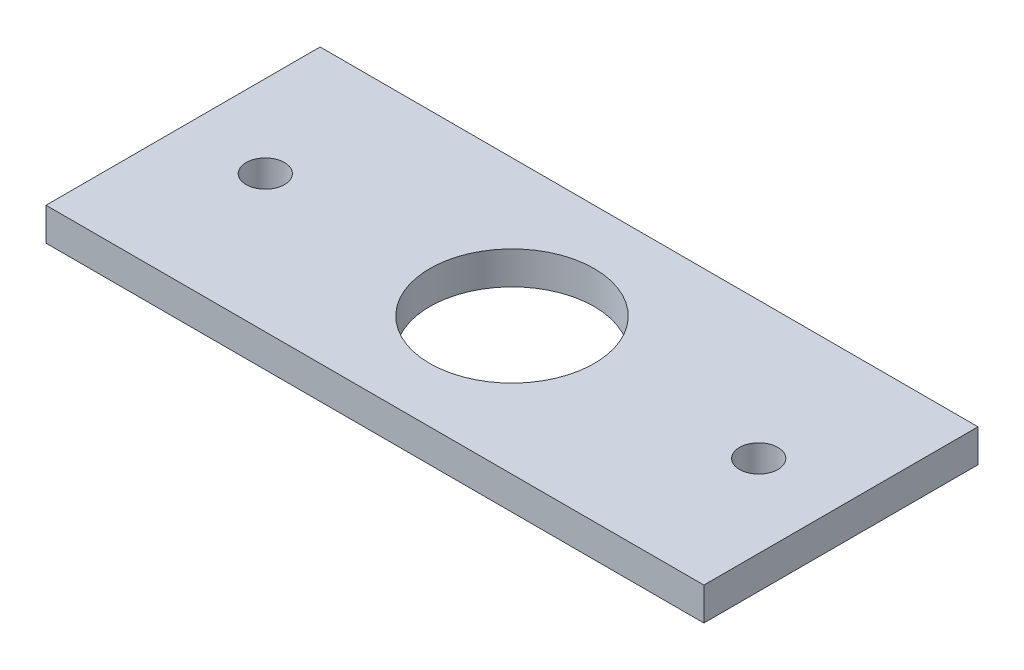
ISO-10303-21;
HEADER;
FILE_DESCRIPTION(('STEP AP214'),'2;1');
FILE_NAME('part.step','',(''),(''),'','','');
FILE_SCHEMA(('AUTOMOTIVE_DESIGN { 1 0 10303 214 1 1 1 1 }'));
ENDSEC;
DATA;
#1=APPLICATION_CONTEXT('core data for automotive mechanical design processes');
#2=APPLICATION_PROTOCOL_DEFINITION('international standard','automotive_design',2000,#1);
#3=PRODUCT_CONTEXT('',#1,'mechanical');
#4=PRODUCT('Part','Part','',(#3));
#5=PRODUCT_RELATED_PRODUCT_CATEGORY('part','',(#4));
#6=PRODUCT_DEFINITION_FORMATION('','',#4);
#7=PRODUCT_DEFINITION_CONTEXT('part definition',#1,'design');
#8=PRODUCT_DEFINITION('design','',#6,#7);
#9=PRODUCT_DEFINITION_SHAPE('','',#8);
#10=(LENGTH_UNIT() NAMED_UNIT(*) SI_UNIT(.MILLI.,.METRE.));
#11=(NAMED_UNIT(*) PLANE_ANGLE_UNIT() SI_UNIT($,.RADIAN.));
#12=(NAMED_UNIT(*) SI_UNIT($,.STERADIAN.) SOLID_ANGLE_UNIT());
#13=UNCERTAINTY_MEASURE_WITH_UNIT(LENGTH_MEASURE(1.E-05),#10,'distance_accuracy_value','');
#14=(GEOMETRIC_REPRESENTATION_CONTEXT(3) GLOBAL_UNCERTAINTY_ASSIGNED_CONTEXT((#13)) GLOBAL_UNIT_ASSIGNED_CONTEXT((#10,
#11,#12)) REPRESENTATION_CONTEXT('',''));
#15=CARTESIAN_POINT('',(0.,0.,0.));
#16=DIRECTION('',(0.,0.,1.));
#17=DIRECTION('',(1.,0.,0.));
#18=AXIS2_PLACEMENT_3D('',#15,#16,#17);
#19=CARTESIAN_POINT('',(0.,3.,0.));
#20=DIRECTION('',(0.,1.,0.));
#21=DIRECTION('',(0.,0.,1.));
#22=AXIS2_PLACEMENT_3D('',#19,#20,#21);
#23=PLANE('',#22);
#24=CARTESIAN_POINT('',(-22.5,3.,0.));
#25=DIRECTION('',(0.,1.,0.));
#26=DIRECTION('',(0.,0.,1.));
#27=AXIS2_PLACEMENT_3D('',#24,#25,#26);
#28=CIRCLE('',#27,1.75);
#29=CARTESIAN_POINT('',(-22.5,3.,1.75));
#30=VERTEX_POINT('',#29);
#31=EDGE_CURVE('E125',#30,#30,#28,.T.);
#32=ORIENTED_EDGE('',*,*,#31,.F.);
#33=EDGE_LOOP('',(#32));
#34=FACE_BOUND('',#33,.T.);
#35=DIRECTION('',(0.,0.,1.));
#36=VECTOR('',#35,1.);
#37=CARTESIAN_POINT('',(-30.,3.,12.5));
#38=LINE('',#37,#36);
#39=CARTESIAN_POINT('',(-30.,3.,-12.5));
#40=VERTEX_POINT('',#39);
#41=CARTESIAN_POINT('',(-30.,3.,12.5));
#42=VERTEX_POINT('',#41);
#43=EDGE_CURVE('E95',#40,#42,#38,.T.);
#44=ORIENTED_EDGE('',*,*,#43,.T.);
#45=DIRECTION('',(1.,0.,0.));
#46=VECTOR('',#45,1.);
#47=CARTESIAN_POINT('',(30.,3.,12.5));
#48=LINE('',#47,#46);
#49=CARTESIAN_POINT('',(30.,3.,12.5));
#50=VERTEX_POINT('',#49);
#51=EDGE_CURVE('E90',#42,#50,#48,.T.);
#52=ORIENTED_EDGE('',*,*,#51,.T.);
#53=DIRECTION('',(0.,0.,-1.));
#54=VECTOR('',#53,1.);
#55=CARTESIAN_POINT('',(30.,3.,12.5));
#56=LINE('',#55,#54);
#57=CARTESIAN_POINT('',(30.,3.,-12.5));
#58=VERTEX_POINT('',#57);
#59=EDGE_CURVE('E93',#50,#58,#56,.T.);
#60=ORIENTED_EDGE('',*,*,#59,.T.);
#61=DIRECTION('',(-1.,0.,0.));
#62=VECTOR('',#61,1.);
#63=CARTESIAN_POINT('',(30.,3.,-12.5));
#64=LINE('',#63,#62);
#65=EDGE_CURVE('E60',#58,#40,#64,.T.);
#66=ORIENTED_EDGE('',*,*,#65,.T.);
#67=EDGE_LOOP('',(#44,#52,#60,#66));
#68=FACE_BOUND('',#67,.T.);
#69=CARTESIAN_POINT('',(0.,3.,0.));
#70=DIRECTION('',(0.,1.,0.));
#71=DIRECTION('',(0.,0.,1.));
#72=AXIS2_PLACEMENT_3D('',#69,#70,#71);
#73=CIRCLE('',#72,7.5);
#74=CARTESIAN_POINT('',(0.,3.,7.5));
#75=VERTEX_POINT('',#74);
#76=EDGE_CURVE('E110',#75,#75,#73,.T.);
#77=ORIENTED_EDGE('',*,*,#76,.F.);
#78=EDGE_LOOP('',(#77));
#79=FACE_BOUND('',#78,.T.);
#80=CARTESIAN_POINT('',(22.5,3.,0.));
#81=DIRECTION('',(0.,1.,0.));
#82=DIRECTION('',(0.,0.,-1.));
#83=AXIS2_PLACEMENT_3D('',#80,#81,#82);
#84=CIRCLE('',#83,1.75);
#85=CARTESIAN_POINT('',(22.5,3.,-1.75));
#86=VERTEX_POINT('',#85);
#87=EDGE_CURVE('E131',#86,#86,#84,.T.);
#88=ORIENTED_EDGE('',*,*,#87,.F.);
#89=EDGE_LOOP('',(#88));
#90=FACE_BOUND('',#89,.T.);
#91=ADVANCED_FACE('F43',(#34,#68,#79,#90),#23,.T.);
#92=CARTESIAN_POINT('',(0.,0.,0.));
#93=DIRECTION('',(0.,1.,0.));
#94=DIRECTION('',(0.,0.,1.));
#95=AXIS2_PLACEMENT_3D('',#92,#93,#94);
#96=PLANE('',#95);
#97=DIRECTION('',(0.,0.,1.));
#98=VECTOR('',#97,1.);
#99=CARTESIAN_POINT('',(-30.,0.,12.5));
#100=LINE('',#99,#98);
#101=CARTESIAN_POINT('',(-30.,0.,-12.5));
#102=VERTEX_POINT('',#101);
#103=CARTESIAN_POINT('',(-30.,0.,12.5));
#104=VERTEX_POINT('',#103);
#105=EDGE_CURVE('E107',#102,#104,#100,.T.);
#106=ORIENTED_EDGE('',*,*,#105,.F.);
#107=DIRECTION('',(-1.,0.,0.));
#108=VECTOR('',#107,1.);
#109=CARTESIAN_POINT('',(30.,0.,-12.5));
#110=LINE('',#109,#108);
#111=CARTESIAN_POINT('',(30.,0.,-12.5));
#112=VERTEX_POINT('',#111);
#113=EDGE_CURVE('E83',#112,#102,#110,.T.);
#114=ORIENTED_EDGE('',*,*,#113,.F.);
#115=DIRECTION('',(0.,0.,-1.));
#116=VECTOR('',#115,1.);
#117=CARTESIAN_POINT('',(30.,0.,12.5));
#118=LINE('',#117,#116);
#119=CARTESIAN_POINT('',(30.,0.,12.5));
#120=VERTEX_POINT('',#119);
#121=EDGE_CURVE('E77',#120,#112,#118,.T.);
#122=ORIENTED_EDGE('',*,*,#121,.F.);
#123=DIRECTION('',(1.,0.,0.));
#124=VECTOR('',#123,1.);
#125=CARTESIAN_POINT('',(30.,0.,12.5));
#126=LINE('',#125,#124);
#127=EDGE_CURVE('E99',#104,#120,#126,.T.);
#128=ORIENTED_EDGE('',*,*,#127,.F.);
#129=EDGE_LOOP('',(#106,#114,#122,#128));
#130=FACE_BOUND('',#129,.T.);
#131=CARTESIAN_POINT('',(0.,0.,0.));
#132=DIRECTION('',(0.,1.,0.));
#133=DIRECTION('',(0.,0.,1.));
#134=AXIS2_PLACEMENT_3D('',#131,#132,#133);
#135=CIRCLE('',#134,7.5);
#136=CARTESIAN_POINT('',(0.,0.,7.5));
#137=VERTEX_POINT('',#136);
#138=EDGE_CURVE('E122',#137,#137,#135,.T.);
#139=ORIENTED_EDGE('',*,*,#138,.T.);
#140=EDGE_LOOP('',(#139));
#141=FACE_BOUND('',#140,.T.);
#142=CARTESIAN_POINT('',(-22.5,0.,0.));
#143=DIRECTION('',(0.,1.,0.));
#144=DIRECTION('',(0.,0.,1.));
#145=AXIS2_PLACEMENT_3D('',#142,#143,#144);
#146=CIRCLE('',#145,1.75);
#147=CARTESIAN_POINT('',(-22.5,0.,1.75));
#148=VERTEX_POINT('',#147);
#149=EDGE_CURVE('E128',#148,#148,#146,.T.);
#150=ORIENTED_EDGE('',*,*,#149,.T.);
#151=EDGE_LOOP('',(#150));
#152=FACE_BOUND('',#151,.T.);
#153=CARTESIAN_POINT('',(22.5,0.,0.));
#154=DIRECTION('',(0.,1.,0.));
#155=DIRECTION('',(0.,0.,-1.));
#156=AXIS2_PLACEMENT_3D('',#153,#154,#155);
#157=CIRCLE('',#156,1.75);
#158=CARTESIAN_POINT('',(22.5,0.,-1.75));
#159=VERTEX_POINT('',#158);
#160=EDGE_CURVE('E134',#159,#159,#157,.T.);
#161=ORIENTED_EDGE('',*,*,#160,.T.);
#162=EDGE_LOOP('',(#161));
#163=FACE_BOUND('',#162,.T.);
#164=ADVANCED_FACE('F118',(#130,#141,#152,#163),#96,.F.);
#165=CARTESIAN_POINT('',(-30.,3.,12.5));
#166=DIRECTION('',(1.,0.,0.));
#167=DIRECTION('',(0.,0.,-1.));
#168=AXIS2_PLACEMENT_3D('',#165,#166,#167);
#169=PLANE('',#168);
#170=ORIENTED_EDGE('',*,*,#105,.T.);
#171=DIRECTION('',(0.,-1.,0.));
#172=VECTOR('',#171,1.);
#173=CARTESIAN_POINT('',(-30.,3.,12.5));
#174=LINE('',#173,#172);
#175=EDGE_CURVE('E11',#42,#104,#174,.T.);
#176=ORIENTED_EDGE('',*,*,#175,.F.);
#177=ORIENTED_EDGE('',*,*,#43,.F.);
#178=DIRECTION('',(0.,-1.,0.));
#179=VECTOR('',#178,1.);
#180=CARTESIAN_POINT('',(-30.,3.,-12.5));
#181=LINE('',#180,#179);
#182=EDGE_CURVE('E103',#40,#102,#181,.T.);
#183=ORIENTED_EDGE('',*,*,#182,.T.);
#184=EDGE_LOOP('',(#170,#176,#177,#183));
#185=FACE_BOUND('',#184,.T.);
#186=ADVANCED_FACE('F45',(#185),#169,.F.);
#187=CARTESIAN_POINT('',(30.,3.,12.5));
#188=DIRECTION('',(0.,0.,-1.));
#189=DIRECTION('',(-1.,0.,0.));
#190=AXIS2_PLACEMENT_3D('',#187,#188,#189);
#191=PLANE('',#190);
#192=ORIENTED_EDGE('',*,*,#127,.T.);
#193=DIRECTION('',(0.,-1.,0.));
#194=VECTOR('',#193,1.);
#195=CARTESIAN_POINT('',(30.,3.,12.5));
#196=LINE('',#195,#194);
#197=EDGE_CURVE('E52',#50,#120,#196,.T.);
#198=ORIENTED_EDGE('',*,*,#197,.F.);
#199=ORIENTED_EDGE('',*,*,#51,.F.);
#200=ORIENTED_EDGE('',*,*,#175,.T.);
#201=EDGE_LOOP('',(#192,#198,#199,#200));
#202=FACE_BOUND('',#201,.T.);
#203=ADVANCED_FACE('F98',(#202),#191,.F.);
#204=CARTESIAN_POINT('',(30.,3.,12.5));
#205=DIRECTION('',(-1.,0.,0.));
#206=DIRECTION('',(0.,0.,1.));
#207=AXIS2_PLACEMENT_3D('',#204,#205,#206);
#208=PLANE('',#207);
#209=ORIENTED_EDGE('',*,*,#121,.T.);
#210=DIRECTION('',(0.,-1.,0.));
#211=VECTOR('',#210,1.);
#212=CARTESIAN_POINT('',(30.,3.,-12.5));
#213=LINE('',#212,#211);
#214=EDGE_CURVE('E100',#58,#112,#213,.T.);
#215=ORIENTED_EDGE('',*,*,#214,.F.);
#216=ORIENTED_EDGE('',*,*,#59,.F.);
#217=ORIENTED_EDGE('',*,*,#197,.T.);
#218=EDGE_LOOP('',(#209,#215,#216,#217));
#219=FACE_BOUND('',#218,.T.);
#220=ADVANCED_FACE('F101',(#219),#208,.F.);
#221=CARTESIAN_POINT('',(30.,3.,-12.5));
#222=DIRECTION('',(0.,0.,1.));
#223=DIRECTION('',(1.,0.,0.));
#224=AXIS2_PLACEMENT_3D('',#221,#222,#223);
#225=PLANE('',#224);
#226=ORIENTED_EDGE('',*,*,#113,.T.);
#227=ORIENTED_EDGE('',*,*,#182,.F.);
#228=ORIENTED_EDGE('',*,*,#65,.F.);
#229=ORIENTED_EDGE('',*,*,#214,.T.);
#230=EDGE_LOOP('',(#226,#227,#228,#229));
#231=FACE_BOUND('',#230,.T.);
#232=ADVANCED_FACE('F115',(#231),#225,.F.);
#233=CARTESIAN_POINT('',(0.,3.,0.));
#234=DIRECTION('',(0.,-1.,0.));
#235=DIRECTION('',(0.,0.,-1.));
#236=AXIS2_PLACEMENT_3D('',#233,#234,#235);
#237=CYLINDRICAL_SURFACE('',#236,7.5);
#238=ORIENTED_EDGE('',*,*,#76,.T.);
#239=EDGE_LOOP('',(#238));
#240=FACE_BOUND('',#239,.T.);
#241=ORIENTED_EDGE('',*,*,#138,.F.);
#242=EDGE_LOOP('',(#241));
#243=FACE_BOUND('',#242,.T.);
#244=ADVANCED_FACE('F152',(#240,#243),#237,.F.);
#245=CARTESIAN_POINT('',(-22.5,3.,0.));
#246=DIRECTION('',(0.,-1.,0.));
#247=DIRECTION('',(0.,0.,-1.));
#248=AXIS2_PLACEMENT_3D('',#245,#246,#247);
#249=CYLINDRICAL_SURFACE('',#248,1.75);
#250=ORIENTED_EDGE('',*,*,#31,.T.);
#251=EDGE_LOOP('',(#250));
#252=FACE_BOUND('',#251,.T.);
#253=ORIENTED_EDGE('',*,*,#149,.F.);
#254=EDGE_LOOP('',(#253));
#255=FACE_BOUND('',#254,.T.);
#256=ADVANCED_FACE('F220',(#252,#255),#249,.F.);
#257=CARTESIAN_POINT('',(22.5,3.,0.));
#258=DIRECTION('',(0.,-1.,0.));
#259=DIRECTION('',(0.,0.,-1.));
#260=AXIS2_PLACEMENT_3D('',#257,#258,#259);
#261=CYLINDRICAL_SURFACE('',#260,1.75);
#262=ORIENTED_EDGE('',*,*,#87,.T.);
#263=EDGE_LOOP('',(#262));
#264=FACE_BOUND('',#263,.T.);
#265=ORIENTED_EDGE('',*,*,#160,.F.);
#266=EDGE_LOOP('',(#265));
#267=FACE_BOUND('',#266,.T.);
#268=ADVANCED_FACE('F140',(#264,#267),#261,.F.);
#269=CLOSED_SHELL('',(#91,#164,#186,#203,#220,#232,#244,#256,#268));
#270=MANIFOLD_SOLID_BREP('B2',#269);
#271=ADVANCED_BREP_SHAPE_REPRESENTATION('',(#18,#270),#14);
#272=SHAPE_DEFINITION_REPRESENTATION(#9,#271);
ENDSEC;
END-ISO-10303-21;
